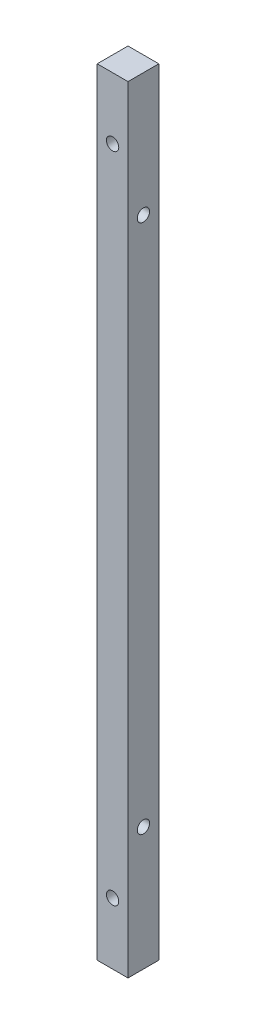
ISO-10303-21;
HEADER;
FILE_DESCRIPTION(('STEP AP214'),'2;1');
FILE_NAME('part.step','',(''),(''),'','','');
FILE_SCHEMA(('AUTOMOTIVE_DESIGN { 1 0 10303 214 1 1 1 1 }'));
ENDSEC;
DATA;
#1=APPLICATION_CONTEXT('core data for automotive mechanical design processes');
#2=APPLICATION_PROTOCOL_DEFINITION('international standard','automotive_design',2000,#1);
#3=PRODUCT_CONTEXT('',#1,'mechanical');
#4=PRODUCT('Part','Part','',(#3));
#5=PRODUCT_RELATED_PRODUCT_CATEGORY('part','',(#4));
#6=PRODUCT_DEFINITION_FORMATION('','',#4);
#7=PRODUCT_DEFINITION_CONTEXT('part definition',#1,'design');
#8=PRODUCT_DEFINITION('design','',#6,#7);
#9=PRODUCT_DEFINITION_SHAPE('','',#8);
#10=(LENGTH_UNIT() NAMED_UNIT(*) SI_UNIT(.MILLI.,.METRE.));
#11=(NAMED_UNIT(*) PLANE_ANGLE_UNIT() SI_UNIT($,.RADIAN.));
#12=(NAMED_UNIT(*) SI_UNIT($,.STERADIAN.) SOLID_ANGLE_UNIT());
#13=UNCERTAINTY_MEASURE_WITH_UNIT(LENGTH_MEASURE(1.E-05),#10,'distance_accuracy_value','');
#14=(GEOMETRIC_REPRESENTATION_CONTEXT(3) GLOBAL_UNCERTAINTY_ASSIGNED_CONTEXT((#13)) GLOBAL_UNIT_ASSIGNED_CONTEXT((#10,
#11,#12)) REPRESENTATION_CONTEXT('',''));
#15=CARTESIAN_POINT('',(0.,0.,0.));
#16=DIRECTION('',(0.,0.,1.));
#17=DIRECTION('',(1.,0.,0.));
#18=AXIS2_PLACEMENT_3D('',#15,#16,#17);
#19=CARTESIAN_POINT('',(0.,0.,5.));
#20=DIRECTION('',(-1.,0.,0.));
#21=DIRECTION('',(0.,0.,1.));
#22=AXIS2_PLACEMENT_3D('',#19,#20,#21);
#23=PLANE('',#22);
#24=CARTESIAN_POINT('',(0.,106.,2.5));
#25=DIRECTION('',(1.,0.,0.));
#26=DIRECTION('',(0.,0.,-1.));
#27=AXIS2_PLACEMENT_3D('',#24,#25,#26);
#28=CIRCLE('',#27,1.);
#29=CARTESIAN_POINT('',(0.,106.,1.5));
#30=VERTEX_POINT('',#29);
#31=EDGE_CURVE('E130',#30,#30,#28,.T.);
#32=ORIENTED_EDGE('',*,*,#31,.F.);
#33=EDGE_LOOP('',(#32));
#34=FACE_BOUND('',#33,.T.);
#35=CARTESIAN_POINT('',(0.,20.,2.5));
#36=DIRECTION('',(1.,0.,0.));
#37=DIRECTION('',(0.,0.,-1.));
#38=AXIS2_PLACEMENT_3D('',#35,#36,#37);
#39=CIRCLE('',#38,1.);
#40=CARTESIAN_POINT('',(0.,20.,1.5));
#41=VERTEX_POINT('',#40);
#42=EDGE_CURVE('E124',#41,#41,#39,.T.);
#43=ORIENTED_EDGE('',*,*,#42,.F.);
#44=EDGE_LOOP('',(#43));
#45=FACE_BOUND('',#44,.T.);
#46=DIRECTION('',(0.,1.,0.));
#47=VECTOR('',#46,1.);
#48=CARTESIAN_POINT('',(0.,0.,0.));
#49=LINE('',#48,#47);
#50=CARTESIAN_POINT('',(0.,0.,0.));
#51=VERTEX_POINT('',#50);
#52=CARTESIAN_POINT('',(0.,126.,0.));
#53=VERTEX_POINT('',#52);
#54=EDGE_CURVE('E98',#51,#53,#49,.T.);
#55=ORIENTED_EDGE('',*,*,#54,.T.);
#56=DIRECTION('',(0.,0.,-1.));
#57=VECTOR('',#56,1.);
#58=CARTESIAN_POINT('',(0.,126.,5.));
#59=LINE('',#58,#57);
#60=CARTESIAN_POINT('',(0.,126.,5.));
#61=VERTEX_POINT('',#60);
#62=EDGE_CURVE('E11',#61,#53,#59,.T.);
#63=ORIENTED_EDGE('',*,*,#62,.F.);
#64=DIRECTION('',(0.,1.,0.));
#65=VECTOR('',#64,1.);
#66=CARTESIAN_POINT('',(0.,0.,5.));
#67=LINE('',#66,#65);
#68=CARTESIAN_POINT('',(0.,0.,5.));
#69=VERTEX_POINT('',#68);
#70=EDGE_CURVE('E86',#69,#61,#67,.T.);
#71=ORIENTED_EDGE('',*,*,#70,.F.);
#72=DIRECTION('',(0.,0.,-1.));
#73=VECTOR('',#72,1.);
#74=CARTESIAN_POINT('',(0.,0.,5.));
#75=LINE('',#74,#73);
#76=EDGE_CURVE('E94',#69,#51,#75,.T.);
#77=ORIENTED_EDGE('',*,*,#76,.T.);
#78=EDGE_LOOP('',(#55,#63,#71,#77));
#79=FACE_BOUND('',#78,.T.);
#80=ADVANCED_FACE('F35',(#34,#45,#79),#23,.F.);
#81=CARTESIAN_POINT('',(0.,126.,5.));
#82=DIRECTION('',(0.,-1.,0.));
#83=DIRECTION('',(0.,0.,-1.));
#84=AXIS2_PLACEMENT_3D('',#81,#82,#83);
#85=PLANE('',#84);
#86=DIRECTION('',(-1.,0.,0.));
#87=VECTOR('',#86,1.);
#88=CARTESIAN_POINT('',(0.,126.,0.));
#89=LINE('',#88,#87);
#90=CARTESIAN_POINT('',(-5.,126.,0.));
#91=VERTEX_POINT('',#90);
#92=EDGE_CURVE('E90',#53,#91,#89,.T.);
#93=ORIENTED_EDGE('',*,*,#92,.T.);
#94=DIRECTION('',(0.,0.,-1.));
#95=VECTOR('',#94,1.);
#96=CARTESIAN_POINT('',(-5.,126.,5.));
#97=LINE('',#96,#95);
#98=CARTESIAN_POINT('',(-5.,126.,5.));
#99=VERTEX_POINT('',#98);
#100=EDGE_CURVE('E43',#99,#91,#97,.T.);
#101=ORIENTED_EDGE('',*,*,#100,.F.);
#102=DIRECTION('',(-1.,0.,0.));
#103=VECTOR('',#102,1.);
#104=CARTESIAN_POINT('',(0.,126.,5.));
#105=LINE('',#104,#103);
#106=EDGE_CURVE('E81',#61,#99,#105,.T.);
#107=ORIENTED_EDGE('',*,*,#106,.F.);
#108=ORIENTED_EDGE('',*,*,#62,.T.);
#109=EDGE_LOOP('',(#93,#101,#107,#108));
#110=FACE_BOUND('',#109,.T.);
#111=ADVANCED_FACE('F89',(#110),#85,.F.);
#112=CARTESIAN_POINT('',(-5.,0.,5.));
#113=DIRECTION('',(1.,0.,0.));
#114=DIRECTION('',(0.,0.,-1.));
#115=AXIS2_PLACEMENT_3D('',#112,#113,#114);
#116=PLANE('',#115);
#117=CARTESIAN_POINT('',(-5.,106.,2.5));
#118=DIRECTION('',(1.,0.,0.));
#119=DIRECTION('',(0.,0.,-1.));
#120=AXIS2_PLACEMENT_3D('',#117,#118,#119);
#121=CIRCLE('',#120,1.);
#122=CARTESIAN_POINT('',(-5.,106.,1.5));
#123=VERTEX_POINT('',#122);
#124=EDGE_CURVE('E116',#123,#123,#121,.T.);
#125=ORIENTED_EDGE('',*,*,#124,.T.);
#126=EDGE_LOOP('',(#125));
#127=FACE_BOUND('',#126,.T.);
#128=CARTESIAN_POINT('',(-5.,20.,2.5));
#129=DIRECTION('',(1.,0.,0.));
#130=DIRECTION('',(0.,0.,-1.));
#131=AXIS2_PLACEMENT_3D('',#128,#129,#130);
#132=CIRCLE('',#131,1.);
#133=CARTESIAN_POINT('',(-5.,20.,1.5));
#134=VERTEX_POINT('',#133);
#135=EDGE_CURVE('E127',#134,#134,#132,.T.);
#136=ORIENTED_EDGE('',*,*,#135,.T.);
#137=EDGE_LOOP('',(#136));
#138=FACE_BOUND('',#137,.T.);
#139=DIRECTION('',(0.,-1.,0.));
#140=VECTOR('',#139,1.);
#141=CARTESIAN_POINT('',(-5.,0.,0.));
#142=LINE('',#141,#140);
#143=CARTESIAN_POINT('',(-5.,0.,0.));
#144=VERTEX_POINT('',#143);
#145=EDGE_CURVE('E68',#91,#144,#142,.T.);
#146=ORIENTED_EDGE('',*,*,#145,.T.);
#147=DIRECTION('',(0.,0.,-1.));
#148=VECTOR('',#147,1.);
#149=CARTESIAN_POINT('',(-5.,0.,5.));
#150=LINE('',#149,#148);
#151=CARTESIAN_POINT('',(-5.,0.,5.));
#152=VERTEX_POINT('',#151);
#153=EDGE_CURVE('E91',#152,#144,#150,.T.);
#154=ORIENTED_EDGE('',*,*,#153,.F.);
#155=DIRECTION('',(0.,-1.,0.));
#156=VECTOR('',#155,1.);
#157=CARTESIAN_POINT('',(-5.,0.,5.));
#158=LINE('',#157,#156);
#159=EDGE_CURVE('E84',#99,#152,#158,.T.);
#160=ORIENTED_EDGE('',*,*,#159,.F.);
#161=ORIENTED_EDGE('',*,*,#100,.T.);
#162=EDGE_LOOP('',(#146,#154,#160,#161));
#163=FACE_BOUND('',#162,.T.);
#164=ADVANCED_FACE('F92',(#127,#138,#163),#116,.F.);
#165=CARTESIAN_POINT('',(0.,0.,5.));
#166=DIRECTION('',(0.,1.,0.));
#167=DIRECTION('',(-1.,0.,0.));
#168=AXIS2_PLACEMENT_3D('',#165,#166,#167);
#169=PLANE('',#168);
#170=DIRECTION('',(1.,0.,0.));
#171=VECTOR('',#170,1.);
#172=CARTESIAN_POINT('',(0.,0.,0.));
#173=LINE('',#172,#171);
#174=EDGE_CURVE('E74',#144,#51,#173,.T.);
#175=ORIENTED_EDGE('',*,*,#174,.T.);
#176=ORIENTED_EDGE('',*,*,#76,.F.);
#177=DIRECTION('',(1.,0.,0.));
#178=VECTOR('',#177,1.);
#179=CARTESIAN_POINT('',(0.,0.,5.));
#180=LINE('',#179,#178);
#181=EDGE_CURVE('E51',#152,#69,#180,.T.);
#182=ORIENTED_EDGE('',*,*,#181,.F.);
#183=ORIENTED_EDGE('',*,*,#153,.T.);
#184=EDGE_LOOP('',(#175,#176,#182,#183));
#185=FACE_BOUND('',#184,.T.);
#186=ADVANCED_FACE('F106',(#185),#169,.F.);
#187=CARTESIAN_POINT('',(0.,0.,5.));
#188=DIRECTION('',(0.,0.,1.));
#189=DIRECTION('',(1.,0.,0.));
#190=AXIS2_PLACEMENT_3D('',#187,#188,#189);
#191=PLANE('',#190);
#192=CARTESIAN_POINT('',(-2.5,116.,5.));
#193=DIRECTION('',(0.,0.,1.));
#194=DIRECTION('',(1.,0.,0.));
#195=AXIS2_PLACEMENT_3D('',#192,#193,#194);
#196=CIRCLE('',#195,1.);
#197=CARTESIAN_POINT('',(-1.5,116.,5.));
#198=VERTEX_POINT('',#197);
#199=EDGE_CURVE('E119',#198,#198,#196,.T.);
#200=ORIENTED_EDGE('',*,*,#199,.F.);
#201=EDGE_LOOP('',(#200));
#202=FACE_BOUND('',#201,.T.);
#203=CARTESIAN_POINT('',(-2.5,10.,5.));
#204=DIRECTION('',(0.,0.,1.));
#205=DIRECTION('',(1.,0.,0.));
#206=AXIS2_PLACEMENT_3D('',#203,#204,#205);
#207=CIRCLE('',#206,1.);
#208=CARTESIAN_POINT('',(-1.5,10.,5.));
#209=VERTEX_POINT('',#208);
#210=EDGE_CURVE('E112',#209,#209,#207,.T.);
#211=ORIENTED_EDGE('',*,*,#210,.F.);
#212=EDGE_LOOP('',(#211));
#213=FACE_BOUND('',#212,.T.);
#214=ORIENTED_EDGE('',*,*,#70,.T.);
#215=ORIENTED_EDGE('',*,*,#106,.T.);
#216=ORIENTED_EDGE('',*,*,#159,.T.);
#217=ORIENTED_EDGE('',*,*,#181,.T.);
#218=EDGE_LOOP('',(#214,#215,#216,#217));
#219=FACE_BOUND('',#218,.T.);
#220=ADVANCED_FACE('F82',(#202,#213,#219),#191,.T.);
#221=CARTESIAN_POINT('',(0.,0.,0.));
#222=DIRECTION('',(0.,0.,1.));
#223=DIRECTION('',(1.,0.,0.));
#224=AXIS2_PLACEMENT_3D('',#221,#222,#223);
#225=PLANE('',#224);
#226=CARTESIAN_POINT('',(-2.5,116.,0.));
#227=DIRECTION('',(0.,0.,1.));
#228=DIRECTION('',(1.,0.,0.));
#229=AXIS2_PLACEMENT_3D('',#226,#227,#228);
#230=CIRCLE('',#229,1.);
#231=CARTESIAN_POINT('',(-1.5,116.,0.));
#232=VERTEX_POINT('',#231);
#233=EDGE_CURVE('E101',#232,#232,#230,.T.);
#234=ORIENTED_EDGE('',*,*,#233,.T.);
#235=EDGE_LOOP('',(#234));
#236=FACE_BOUND('',#235,.T.);
#237=CARTESIAN_POINT('',(-2.5,10.,0.));
#238=DIRECTION('',(0.,0.,1.));
#239=DIRECTION('',(1.,0.,0.));
#240=AXIS2_PLACEMENT_3D('',#237,#238,#239);
#241=CIRCLE('',#240,1.);
#242=CARTESIAN_POINT('',(-1.5,10.,0.));
#243=VERTEX_POINT('',#242);
#244=EDGE_CURVE('E115',#243,#243,#241,.T.);
#245=ORIENTED_EDGE('',*,*,#244,.T.);
#246=EDGE_LOOP('',(#245));
#247=FACE_BOUND('',#246,.T.);
#248=ORIENTED_EDGE('',*,*,#54,.F.);
#249=ORIENTED_EDGE('',*,*,#174,.F.);
#250=ORIENTED_EDGE('',*,*,#145,.F.);
#251=ORIENTED_EDGE('',*,*,#92,.F.);
#252=EDGE_LOOP('',(#248,#249,#250,#251));
#253=FACE_BOUND('',#252,.T.);
#254=ADVANCED_FACE('F109',(#236,#247,#253),#225,.F.);
#255=CARTESIAN_POINT('',(-2.5,10.,0.));
#256=DIRECTION('',(0.,0.,1.));
#257=DIRECTION('',(1.,0.,0.));
#258=AXIS2_PLACEMENT_3D('',#255,#256,#257);
#259=CYLINDRICAL_SURFACE('',#258,1.);
#260=ORIENTED_EDGE('',*,*,#244,.F.);
#261=EDGE_LOOP('',(#260));
#262=FACE_BOUND('',#261,.T.);
#263=ORIENTED_EDGE('',*,*,#210,.T.);
#264=EDGE_LOOP('',(#263));
#265=FACE_BOUND('',#264,.T.);
#266=ADVANCED_FACE('F156',(#262,#265),#259,.F.);
#267=CARTESIAN_POINT('',(-2.5,116.,0.));
#268=DIRECTION('',(0.,0.,1.));
#269=DIRECTION('',(1.,0.,0.));
#270=AXIS2_PLACEMENT_3D('',#267,#268,#269);
#271=CYLINDRICAL_SURFACE('',#270,1.);
#272=ORIENTED_EDGE('',*,*,#233,.F.);
#273=EDGE_LOOP('',(#272));
#274=FACE_BOUND('',#273,.T.);
#275=ORIENTED_EDGE('',*,*,#199,.T.);
#276=EDGE_LOOP('',(#275));
#277=FACE_BOUND('',#276,.T.);
#278=ADVANCED_FACE('F150',(#274,#277),#271,.F.);
#279=CARTESIAN_POINT('',(-5.,20.,2.5));
#280=DIRECTION('',(1.,0.,0.));
#281=DIRECTION('',(0.,0.,-1.));
#282=AXIS2_PLACEMENT_3D('',#279,#280,#281);
#283=CYLINDRICAL_SURFACE('',#282,1.);
#284=ORIENTED_EDGE('',*,*,#135,.F.);
#285=EDGE_LOOP('',(#284));
#286=FACE_BOUND('',#285,.T.);
#287=ORIENTED_EDGE('',*,*,#42,.T.);
#288=EDGE_LOOP('',(#287));
#289=FACE_BOUND('',#288,.T.);
#290=ADVANCED_FACE('F141',(#286,#289),#283,.F.);
#291=CARTESIAN_POINT('',(-5.,106.,2.5));
#292=DIRECTION('',(1.,0.,0.));
#293=DIRECTION('',(0.,0.,-1.));
#294=AXIS2_PLACEMENT_3D('',#291,#292,#293);
#295=CYLINDRICAL_SURFACE('',#294,1.);
#296=ORIENTED_EDGE('',*,*,#124,.F.);
#297=EDGE_LOOP('',(#296));
#298=FACE_BOUND('',#297,.T.);
#299=ORIENTED_EDGE('',*,*,#31,.T.);
#300=EDGE_LOOP('',(#299));
#301=FACE_BOUND('',#300,.T.);
#302=ADVANCED_FACE('F138',(#298,#301),#295,.F.);
#303=CLOSED_SHELL('',(#80,#111,#164,#186,#220,#254,#266,#278,#290,#302));
#304=MANIFOLD_SOLID_BREP('B2',#303);
#305=ADVANCED_BREP_SHAPE_REPRESENTATION('',(#18,#304),#14);
#306=SHAPE_DEFINITION_REPRESENTATION(#9,#305);
ENDSEC;
END-ISO-10303-21;
